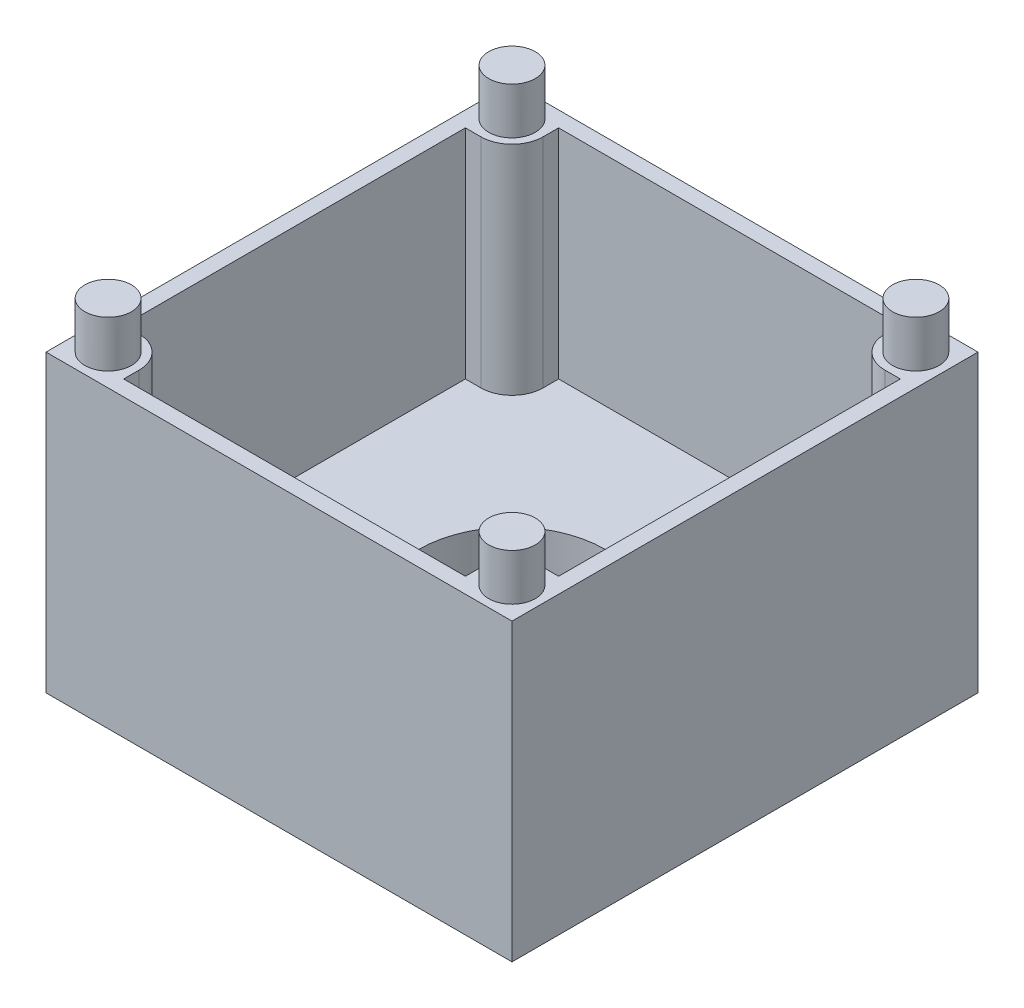
ISO-10303-21;
HEADER;
FILE_DESCRIPTION(('STEP AP214'),'2;1');
FILE_NAME('part.step','',(''),(''),'','','');
FILE_SCHEMA(('AUTOMOTIVE_DESIGN { 1 0 10303 214 1 1 1 1 }'));
ENDSEC;
DATA;
#1=APPLICATION_CONTEXT('core data for automotive mechanical design processes');
#2=APPLICATION_PROTOCOL_DEFINITION('international standard','automotive_design',2000,#1);
#3=PRODUCT_CONTEXT('',#1,'mechanical');
#4=PRODUCT('Part','Part','',(#3));
#5=PRODUCT_RELATED_PRODUCT_CATEGORY('part','',(#4));
#6=PRODUCT_DEFINITION_FORMATION('','',#4);
#7=PRODUCT_DEFINITION_CONTEXT('part definition',#1,'design');
#8=PRODUCT_DEFINITION('design','',#6,#7);
#9=PRODUCT_DEFINITION_SHAPE('','',#8);
#10=(LENGTH_UNIT() NAMED_UNIT(*) SI_UNIT(.MILLI.,.METRE.));
#11=(NAMED_UNIT(*) PLANE_ANGLE_UNIT() SI_UNIT($,.RADIAN.));
#12=(NAMED_UNIT(*) SI_UNIT($,.STERADIAN.) SOLID_ANGLE_UNIT());
#13=UNCERTAINTY_MEASURE_WITH_UNIT(LENGTH_MEASURE(1.E-05),#10,'distance_accuracy_value','');
#14=(GEOMETRIC_REPRESENTATION_CONTEXT(3) GLOBAL_UNCERTAINTY_ASSIGNED_CONTEXT((#13)) GLOBAL_UNIT_ASSIGNED_CONTEXT((#10,
#11,#12)) REPRESENTATION_CONTEXT('',''));
#15=CARTESIAN_POINT('',(0.,0.,0.));
#16=DIRECTION('',(0.,0.,1.));
#17=DIRECTION('',(1.,0.,0.));
#18=AXIS2_PLACEMENT_3D('',#15,#16,#17);
#19=CARTESIAN_POINT('',(-7.5,9.5,-7.5));
#20=DIRECTION('',(0.,-1.,0.));
#21=DIRECTION('',(0.,0.,-1.));
#22=AXIS2_PLACEMENT_3D('',#19,#20,#21);
#23=PLANE('',#22);
#24=CARTESIAN_POINT('',(6.5,9.5,6.5));
#25=DIRECTION('',(0.,-1.,0.));
#26=DIRECTION('',(0.,0.,-1.));
#27=AXIS2_PLACEMENT_3D('',#24,#25,#26);
#28=CIRCLE('',#27,0.749999999999999);
#29=CARTESIAN_POINT('',(6.5,9.5,5.75));
#30=VERTEX_POINT('',#29);
#31=EDGE_CURVE('E42',#30,#30,#28,.F.);
#32=ORIENTED_EDGE('',*,*,#31,.F.);
#33=EDGE_LOOP('',(#32));
#34=FACE_BOUND('',#33,.T.);
#35=CARTESIAN_POINT('',(-6.5,9.5,-6.5));
#36=DIRECTION('',(0.,-1.,0.));
#37=DIRECTION('',(0.,0.,-1.));
#38=AXIS2_PLACEMENT_3D('',#35,#36,#37);
#39=CIRCLE('',#38,0.749999999999999);
#40=CARTESIAN_POINT('',(-6.5,9.5,-7.25));
#41=VERTEX_POINT('',#40);
#42=EDGE_CURVE('E341',#41,#41,#39,.F.);
#43=ORIENTED_EDGE('',*,*,#42,.F.);
#44=EDGE_LOOP('',(#43));
#45=FACE_BOUND('',#44,.T.);
#46=DIRECTION('',(0.,0.,1.));
#47=VECTOR('',#46,1.);
#48=CARTESIAN_POINT('',(-5.5,9.5,6.5));
#49=LINE('',#48,#47);
#50=CARTESIAN_POINT('',(-5.5,9.5,6.5));
#51=VERTEX_POINT('',#50);
#52=CARTESIAN_POINT('',(-5.5,9.5,7.));
#53=VERTEX_POINT('',#52);
#54=EDGE_CURVE('E249',#51,#53,#49,.T.);
#55=ORIENTED_EDGE('',*,*,#54,.F.);
#56=CARTESIAN_POINT('',(-6.5,9.5,6.5));
#57=DIRECTION('',(0.,-1.,0.));
#58=DIRECTION('',(0.,0.,1.));
#59=AXIS2_PLACEMENT_3D('',#56,#57,#58);
#60=CIRCLE('',#59,1.);
#61=CARTESIAN_POINT('',(-6.5,9.5,5.5));
#62=VERTEX_POINT('',#61);
#63=EDGE_CURVE('E49',#62,#51,#60,.T.);
#64=ORIENTED_EDGE('',*,*,#63,.F.);
#65=DIRECTION('',(1.,0.,0.));
#66=VECTOR('',#65,1.);
#67=CARTESIAN_POINT('',(-6.5,9.5,5.5));
#68=LINE('',#67,#66);
#69=CARTESIAN_POINT('',(-7.,9.5,5.5));
#70=VERTEX_POINT('',#69);
#71=EDGE_CURVE('E202',#70,#62,#68,.T.);
#72=ORIENTED_EDGE('',*,*,#71,.F.);
#73=DIRECTION('',(0.,0.,1.));
#74=VECTOR('',#73,1.);
#75=CARTESIAN_POINT('',(-7.,9.5,5.5));
#76=LINE('',#75,#74);
#77=CARTESIAN_POINT('',(-7.,9.5,-5.5));
#78=VERTEX_POINT('',#77);
#79=EDGE_CURVE('E205',#78,#70,#76,.T.);
#80=ORIENTED_EDGE('',*,*,#79,.F.);
#81=DIRECTION('',(-1.,0.,0.));
#82=VECTOR('',#81,1.);
#83=CARTESIAN_POINT('',(-6.5,9.5,-5.5));
#84=LINE('',#83,#82);
#85=CARTESIAN_POINT('',(-6.5,9.5,-5.5));
#86=VERTEX_POINT('',#85);
#87=EDGE_CURVE('E284',#86,#78,#84,.T.);
#88=ORIENTED_EDGE('',*,*,#87,.F.);
#89=CARTESIAN_POINT('',(-6.5,9.5,-6.5));
#90=DIRECTION('',(0.,-1.,0.));
#91=DIRECTION('',(0.,0.,1.));
#92=AXIS2_PLACEMENT_3D('',#89,#90,#91);
#93=CIRCLE('',#92,1.);
#94=CARTESIAN_POINT('',(-5.5,9.5,-6.5));
#95=VERTEX_POINT('',#94);
#96=EDGE_CURVE('E281',#95,#86,#93,.T.);
#97=ORIENTED_EDGE('',*,*,#96,.F.);
#98=DIRECTION('',(0.,0.,1.));
#99=VECTOR('',#98,1.);
#100=CARTESIAN_POINT('',(-5.5,9.5,-6.5));
#101=LINE('',#100,#99);
#102=CARTESIAN_POINT('',(-5.5,9.5,-7.));
#103=VERTEX_POINT('',#102);
#104=EDGE_CURVE('E278',#103,#95,#101,.T.);
#105=ORIENTED_EDGE('',*,*,#104,.F.);
#106=DIRECTION('',(-1.,0.,0.));
#107=VECTOR('',#106,1.);
#108=CARTESIAN_POINT('',(-5.5,9.5,-7.));
#109=LINE('',#108,#107);
#110=CARTESIAN_POINT('',(5.5,9.5,-7.));
#111=VERTEX_POINT('',#110);
#112=EDGE_CURVE('E275',#111,#103,#109,.T.);
#113=ORIENTED_EDGE('',*,*,#112,.F.);
#114=DIRECTION('',(0.,0.,-1.));
#115=VECTOR('',#114,1.);
#116=CARTESIAN_POINT('',(5.5,9.5,-6.5));
#117=LINE('',#116,#115);
#118=CARTESIAN_POINT('',(5.5,9.5,-6.5));
#119=VERTEX_POINT('',#118);
#120=EDGE_CURVE('E272',#119,#111,#117,.T.);
#121=ORIENTED_EDGE('',*,*,#120,.F.);
#122=CARTESIAN_POINT('',(6.5,9.5,-6.5));
#123=DIRECTION('',(0.,-1.,0.));
#124=DIRECTION('',(0.,0.,1.));
#125=AXIS2_PLACEMENT_3D('',#122,#123,#124);
#126=CIRCLE('',#125,1.);
#127=CARTESIAN_POINT('',(6.5,9.5,-5.5));
#128=VERTEX_POINT('',#127);
#129=EDGE_CURVE('E269',#128,#119,#126,.T.);
#130=ORIENTED_EDGE('',*,*,#129,.F.);
#131=DIRECTION('',(-1.,0.,0.));
#132=VECTOR('',#131,1.);
#133=CARTESIAN_POINT('',(6.5,9.5,-5.5));
#134=LINE('',#133,#132);
#135=CARTESIAN_POINT('',(7.,9.5,-5.5));
#136=VERTEX_POINT('',#135);
#137=EDGE_CURVE('E266',#136,#128,#134,.T.);
#138=ORIENTED_EDGE('',*,*,#137,.F.);
#139=DIRECTION('',(0.,0.,-1.));
#140=VECTOR('',#139,1.);
#141=CARTESIAN_POINT('',(7.,9.5,5.5));
#142=LINE('',#141,#140);
#143=CARTESIAN_POINT('',(7.,9.5,5.5));
#144=VERTEX_POINT('',#143);
#145=EDGE_CURVE('E263',#144,#136,#142,.T.);
#146=ORIENTED_EDGE('',*,*,#145,.F.);
#147=DIRECTION('',(1.,0.,0.));
#148=VECTOR('',#147,1.);
#149=CARTESIAN_POINT('',(6.5,9.5,5.5));
#150=LINE('',#149,#148);
#151=CARTESIAN_POINT('',(6.5,9.5,5.5));
#152=VERTEX_POINT('',#151);
#153=EDGE_CURVE('E260',#152,#144,#150,.T.);
#154=ORIENTED_EDGE('',*,*,#153,.F.);
#155=CARTESIAN_POINT('',(6.5,9.5,6.5));
#156=DIRECTION('',(0.,-1.,0.));
#157=DIRECTION('',(0.,0.,1.));
#158=AXIS2_PLACEMENT_3D('',#155,#156,#157);
#159=CIRCLE('',#158,1.);
#160=CARTESIAN_POINT('',(5.5,9.5,6.5));
#161=VERTEX_POINT('',#160);
#162=EDGE_CURVE('E257',#161,#152,#159,.T.);
#163=ORIENTED_EDGE('',*,*,#162,.F.);
#164=DIRECTION('',(0.,0.,-1.));
#165=VECTOR('',#164,1.);
#166=CARTESIAN_POINT('',(5.5,9.5,6.5));
#167=LINE('',#166,#165);
#168=CARTESIAN_POINT('',(5.5,9.5,7.));
#169=VERTEX_POINT('',#168);
#170=EDGE_CURVE('E254',#169,#161,#167,.T.);
#171=ORIENTED_EDGE('',*,*,#170,.F.);
#172=DIRECTION('',(1.,0.,0.));
#173=VECTOR('',#172,1.);
#174=CARTESIAN_POINT('',(-5.5,9.5,7.));
#175=LINE('',#174,#173);
#176=EDGE_CURVE('E251',#53,#169,#175,.T.);
#177=ORIENTED_EDGE('',*,*,#176,.F.);
#178=EDGE_LOOP('',(#55,#64,#72,#80,#88,#97,#105,#113,#121,#130,#138,#146,#154,#163,#171,#177));
#179=FACE_BOUND('',#178,.T.);
#180=DIRECTION('',(0.,0.,1.));
#181=VECTOR('',#180,1.);
#182=CARTESIAN_POINT('',(-7.5,9.5,7.5));
#183=LINE('',#182,#181);
#184=CARTESIAN_POINT('',(-7.5,9.5,-7.5));
#185=VERTEX_POINT('',#184);
#186=CARTESIAN_POINT('',(-7.5,9.5,7.5));
#187=VERTEX_POINT('',#186);
#188=EDGE_CURVE('E319',#185,#187,#183,.T.);
#189=ORIENTED_EDGE('',*,*,#188,.T.);
#190=DIRECTION('',(1.,0.,0.));
#191=VECTOR('',#190,1.);
#192=CARTESIAN_POINT('',(-7.5,9.5,7.5));
#193=LINE('',#192,#191);
#194=CARTESIAN_POINT('',(7.5,9.5,7.5));
#195=VERTEX_POINT('',#194);
#196=EDGE_CURVE('E87',#187,#195,#193,.T.);
#197=ORIENTED_EDGE('',*,*,#196,.T.);
#198=DIRECTION('',(0.,0.,-1.));
#199=VECTOR('',#198,1.);
#200=CARTESIAN_POINT('',(7.5,9.5,7.5));
#201=LINE('',#200,#199);
#202=CARTESIAN_POINT('',(7.5,9.5,-7.5));
#203=VERTEX_POINT('',#202);
#204=EDGE_CURVE('E322',#195,#203,#201,.T.);
#205=ORIENTED_EDGE('',*,*,#204,.T.);
#206=DIRECTION('',(-1.,0.,0.));
#207=VECTOR('',#206,1.);
#208=CARTESIAN_POINT('',(-7.5,9.5,-7.5));
#209=LINE('',#208,#207);
#210=EDGE_CURVE('E58',#203,#185,#209,.T.);
#211=ORIENTED_EDGE('',*,*,#210,.T.);
#212=EDGE_LOOP('',(#189,#197,#205,#211));
#213=FACE_BOUND('',#212,.T.);
#214=CARTESIAN_POINT('',(-6.5,9.5,6.5));
#215=DIRECTION('',(0.,-1.,0.));
#216=DIRECTION('',(0.,0.,-1.));
#217=AXIS2_PLACEMENT_3D('',#214,#215,#216);
#218=CIRCLE('',#217,0.749999999999999);
#219=CARTESIAN_POINT('',(-6.5,9.5,5.75));
#220=VERTEX_POINT('',#219);
#221=EDGE_CURVE('E344',#220,#220,#218,.F.);
#222=ORIENTED_EDGE('',*,*,#221,.F.);
#223=EDGE_LOOP('',(#222));
#224=FACE_BOUND('',#223,.T.);
#225=CARTESIAN_POINT('',(6.5,9.5,-6.5));
#226=DIRECTION('',(0.,-1.,0.));
#227=DIRECTION('',(0.,0.,-1.));
#228=AXIS2_PLACEMENT_3D('',#225,#226,#227);
#229=CIRCLE('',#228,0.749999999999999);
#230=CARTESIAN_POINT('',(6.5,9.5,-7.25));
#231=VERTEX_POINT('',#230);
#232=EDGE_CURVE('E11',#231,#231,#229,.F.);
#233=ORIENTED_EDGE('',*,*,#232,.F.);
#234=EDGE_LOOP('',(#233));
#235=FACE_BOUND('',#234,.T.);
#236=ADVANCED_FACE('F34',(#34,#45,#179,#213,#224,#235),#23,.F.);
#237=CARTESIAN_POINT('',(-7.5,9.5,7.5));
#238=DIRECTION('',(1.,0.,0.));
#239=DIRECTION('',(0.,0.,-1.));
#240=AXIS2_PLACEMENT_3D('',#237,#238,#239);
#241=PLANE('',#240);
#242=DIRECTION('',(0.,0.,1.));
#243=VECTOR('',#242,1.);
#244=CARTESIAN_POINT('',(-7.5,0.,7.5));
#245=LINE('',#244,#243);
#246=CARTESIAN_POINT('',(-7.5,0.,-7.5));
#247=VERTEX_POINT('',#246);
#248=CARTESIAN_POINT('',(-7.5,0.,7.5));
#249=VERTEX_POINT('',#248);
#250=EDGE_CURVE('E291',#247,#249,#245,.T.);
#251=ORIENTED_EDGE('',*,*,#250,.T.);
#252=DIRECTION('',(0.,-1.,0.));
#253=VECTOR('',#252,1.);
#254=CARTESIAN_POINT('',(-7.5,9.5,7.5));
#255=LINE('',#254,#253);
#256=EDGE_CURVE('E339',#187,#249,#255,.T.);
#257=ORIENTED_EDGE('',*,*,#256,.F.);
#258=ORIENTED_EDGE('',*,*,#188,.F.);
#259=DIRECTION('',(0.,-1.,0.));
#260=VECTOR('',#259,1.);
#261=CARTESIAN_POINT('',(-7.5,9.5,-7.5));
#262=LINE('',#261,#260);
#263=EDGE_CURVE('E325',#185,#247,#262,.T.);
#264=ORIENTED_EDGE('',*,*,#263,.T.);
#265=EDGE_LOOP('',(#251,#257,#258,#264));
#266=FACE_BOUND('',#265,.T.);
#267=ADVANCED_FACE('F36',(#266),#241,.F.);
#268=CARTESIAN_POINT('',(-7.5,9.5,7.5));
#269=DIRECTION('',(0.,0.,-1.));
#270=DIRECTION('',(-1.,0.,0.));
#271=AXIS2_PLACEMENT_3D('',#268,#269,#270);
#272=PLANE('',#271);
#273=DIRECTION('',(1.,0.,0.));
#274=VECTOR('',#273,1.);
#275=CARTESIAN_POINT('',(-7.5,0.,7.5));
#276=LINE('',#275,#274);
#277=CARTESIAN_POINT('',(7.5,0.,7.5));
#278=VERTEX_POINT('',#277);
#279=EDGE_CURVE('E328',#249,#278,#276,.T.);
#280=ORIENTED_EDGE('',*,*,#279,.T.);
#281=DIRECTION('',(0.,-1.,0.));
#282=VECTOR('',#281,1.);
#283=CARTESIAN_POINT('',(7.5,9.5,7.5));
#284=LINE('',#283,#282);
#285=EDGE_CURVE('E336',#195,#278,#284,.T.);
#286=ORIENTED_EDGE('',*,*,#285,.F.);
#287=ORIENTED_EDGE('',*,*,#196,.F.);
#288=ORIENTED_EDGE('',*,*,#256,.T.);
#289=EDGE_LOOP('',(#280,#286,#287,#288));
#290=FACE_BOUND('',#289,.T.);
#291=ADVANCED_FACE('F473',(#290),#272,.F.);
#292=CARTESIAN_POINT('',(7.5,9.5,7.5));
#293=DIRECTION('',(-1.,0.,0.));
#294=DIRECTION('',(0.,0.,1.));
#295=AXIS2_PLACEMENT_3D('',#292,#293,#294);
#296=PLANE('',#295);
#297=DIRECTION('',(0.,0.,-1.));
#298=VECTOR('',#297,1.);
#299=CARTESIAN_POINT('',(7.5,0.,7.5));
#300=LINE('',#299,#298);
#301=CARTESIAN_POINT('',(7.5,0.,-7.5));
#302=VERTEX_POINT('',#301);
#303=EDGE_CURVE('E330',#278,#302,#300,.T.);
#304=ORIENTED_EDGE('',*,*,#303,.T.);
#305=DIRECTION('',(0.,-1.,0.));
#306=VECTOR('',#305,1.);
#307=CARTESIAN_POINT('',(7.5,9.5,-7.5));
#308=LINE('',#307,#306);
#309=EDGE_CURVE('E334',#203,#302,#308,.T.);
#310=ORIENTED_EDGE('',*,*,#309,.F.);
#311=ORIENTED_EDGE('',*,*,#204,.F.);
#312=ORIENTED_EDGE('',*,*,#285,.T.);
#313=EDGE_LOOP('',(#304,#310,#311,#312));
#314=FACE_BOUND('',#313,.T.);
#315=ADVANCED_FACE('F471',(#314),#296,.F.);
#316=CARTESIAN_POINT('',(-7.5,9.5,-7.5));
#317=DIRECTION('',(0.,0.,1.));
#318=DIRECTION('',(1.,0.,0.));
#319=AXIS2_PLACEMENT_3D('',#316,#317,#318);
#320=PLANE('',#319);
#321=DIRECTION('',(-1.,0.,0.));
#322=VECTOR('',#321,1.);
#323=CARTESIAN_POINT('',(-7.5,0.,-7.5));
#324=LINE('',#323,#322);
#325=EDGE_CURVE('E79',#302,#247,#324,.T.);
#326=ORIENTED_EDGE('',*,*,#325,.T.);
#327=ORIENTED_EDGE('',*,*,#263,.F.);
#328=ORIENTED_EDGE('',*,*,#210,.F.);
#329=ORIENTED_EDGE('',*,*,#309,.T.);
#330=EDGE_LOOP('',(#326,#327,#328,#329));
#331=FACE_BOUND('',#330,.T.);
#332=ADVANCED_FACE('F467',(#331),#320,.F.);
#333=CARTESIAN_POINT('',(-7.5,0.,-7.5));
#334=DIRECTION('',(0.,-1.,0.));
#335=DIRECTION('',(0.,0.,-1.));
#336=AXIS2_PLACEMENT_3D('',#333,#334,#335);
#337=PLANE('',#336);
#338=CARTESIAN_POINT('',(0.,0.,0.));
#339=DIRECTION('',(0.,-1.,0.));
#340=DIRECTION('',(0.,0.,-1.));
#341=AXIS2_PLACEMENT_3D('',#338,#339,#340);
#342=CIRCLE('',#341,3.);
#343=CARTESIAN_POINT('',(0.,0.,-3.));
#344=VERTEX_POINT('',#343);
#345=EDGE_CURVE('E573',#344,#344,#342,.T.);
#346=ORIENTED_EDGE('',*,*,#345,.F.);
#347=EDGE_LOOP('',(#346));
#348=FACE_BOUND('',#347,.T.);
#349=ORIENTED_EDGE('',*,*,#250,.F.);
#350=ORIENTED_EDGE('',*,*,#325,.F.);
#351=ORIENTED_EDGE('',*,*,#303,.F.);
#352=ORIENTED_EDGE('',*,*,#279,.F.);
#353=EDGE_LOOP('',(#349,#350,#351,#352));
#354=FACE_BOUND('',#353,.T.);
#355=ADVANCED_FACE('F463',(#348,#354),#337,.T.);
#356=CARTESIAN_POINT('',(-6.5,2.5,6.5));
#357=DIRECTION('',(0.,1.,0.));
#358=DIRECTION('',(0.,0.,1.));
#359=AXIS2_PLACEMENT_3D('',#356,#357,#358);
#360=CYLINDRICAL_SURFACE('',#359,1.);
#361=ORIENTED_EDGE('',*,*,#63,.T.);
#362=DIRECTION('',(0.,1.,0.));
#363=VECTOR('',#362,1.);
#364=CARTESIAN_POINT('',(-5.5,2.5,6.5));
#365=LINE('',#364,#363);
#366=CARTESIAN_POINT('',(-5.5,2.5,6.5));
#367=VERTEX_POINT('',#366);
#368=EDGE_CURVE('E179',#367,#51,#365,.T.);
#369=ORIENTED_EDGE('',*,*,#368,.F.);
#370=CARTESIAN_POINT('',(-6.5,2.5,6.5));
#371=DIRECTION('',(0.,-1.,0.));
#372=DIRECTION('',(0.,0.,1.));
#373=AXIS2_PLACEMENT_3D('',#370,#371,#372);
#374=CIRCLE('',#373,1.);
#375=CARTESIAN_POINT('',(-6.5,2.5,5.5));
#376=VERTEX_POINT('',#375);
#377=EDGE_CURVE('E183',#376,#367,#374,.T.);
#378=ORIENTED_EDGE('',*,*,#377,.F.);
#379=DIRECTION('',(0.,1.,0.));
#380=VECTOR('',#379,1.);
#381=CARTESIAN_POINT('',(-6.5,2.5,5.5));
#382=LINE('',#381,#380);
#383=EDGE_CURVE('E289',#376,#62,#382,.T.);
#384=ORIENTED_EDGE('',*,*,#383,.T.);
#385=EDGE_LOOP('',(#361,#369,#378,#384));
#386=FACE_BOUND('',#385,.T.);
#387=ADVANCED_FACE('F181',(#386),#360,.T.);
#388=CARTESIAN_POINT('',(-6.5,2.5,5.5));
#389=DIRECTION('',(0.,0.,1.));
#390=DIRECTION('',(1.,0.,0.));
#391=AXIS2_PLACEMENT_3D('',#388,#389,#390);
#392=PLANE('',#391);
#393=ORIENTED_EDGE('',*,*,#71,.T.);
#394=ORIENTED_EDGE('',*,*,#383,.F.);
#395=DIRECTION('',(1.,0.,0.));
#396=VECTOR('',#395,1.);
#397=CARTESIAN_POINT('',(-6.5,2.5,5.5));
#398=LINE('',#397,#396);
#399=CARTESIAN_POINT('',(-7.,2.5,5.5));
#400=VERTEX_POINT('',#399);
#401=EDGE_CURVE('E189',#400,#376,#398,.T.);
#402=ORIENTED_EDGE('',*,*,#401,.F.);
#403=DIRECTION('',(0.,1.,0.));
#404=VECTOR('',#403,1.);
#405=CARTESIAN_POINT('',(-7.,2.5,5.5));
#406=LINE('',#405,#404);
#407=EDGE_CURVE('E292',#400,#70,#406,.T.);
#408=ORIENTED_EDGE('',*,*,#407,.T.);
#409=EDGE_LOOP('',(#393,#394,#402,#408));
#410=FACE_BOUND('',#409,.T.);
#411=ADVANCED_FACE('F404',(#410),#392,.F.);
#412=CARTESIAN_POINT('',(-7.,2.5,5.5));
#413=DIRECTION('',(-1.,0.,0.));
#414=DIRECTION('',(0.,0.,1.));
#415=AXIS2_PLACEMENT_3D('',#412,#413,#414);
#416=PLANE('',#415);
#417=ORIENTED_EDGE('',*,*,#79,.T.);
#418=ORIENTED_EDGE('',*,*,#407,.F.);
#419=DIRECTION('',(0.,0.,1.));
#420=VECTOR('',#419,1.);
#421=CARTESIAN_POINT('',(-7.,2.5,5.5));
#422=LINE('',#421,#420);
#423=CARTESIAN_POINT('',(-7.,2.5,-5.5));
#424=VERTEX_POINT('',#423);
#425=EDGE_CURVE('E245',#424,#400,#422,.T.);
#426=ORIENTED_EDGE('',*,*,#425,.F.);
#427=DIRECTION('',(0.,1.,0.));
#428=VECTOR('',#427,1.);
#429=CARTESIAN_POINT('',(-7.,2.5,-5.5));
#430=LINE('',#429,#428);
#431=EDGE_CURVE('E294',#424,#78,#430,.T.);
#432=ORIENTED_EDGE('',*,*,#431,.T.);
#433=EDGE_LOOP('',(#417,#418,#426,#432));
#434=FACE_BOUND('',#433,.T.);
#435=ADVANCED_FACE('F407',(#434),#416,.F.);
#436=CARTESIAN_POINT('',(-6.5,2.5,-5.5));
#437=DIRECTION('',(0.,0.,-1.));
#438=DIRECTION('',(-1.,0.,0.));
#439=AXIS2_PLACEMENT_3D('',#436,#437,#438);
#440=PLANE('',#439);
#441=ORIENTED_EDGE('',*,*,#87,.T.);
#442=ORIENTED_EDGE('',*,*,#431,.F.);
#443=DIRECTION('',(-1.,0.,0.));
#444=VECTOR('',#443,1.);
#445=CARTESIAN_POINT('',(-6.5,2.5,-5.5));
#446=LINE('',#445,#444);
#447=CARTESIAN_POINT('',(-6.5,2.5,-5.5));
#448=VERTEX_POINT('',#447);
#449=EDGE_CURVE('E242',#448,#424,#446,.T.);
#450=ORIENTED_EDGE('',*,*,#449,.F.);
#451=DIRECTION('',(0.,1.,0.));
#452=VECTOR('',#451,1.);
#453=CARTESIAN_POINT('',(-6.5,2.5,-5.5));
#454=LINE('',#453,#452);
#455=EDGE_CURVE('E296',#448,#86,#454,.T.);
#456=ORIENTED_EDGE('',*,*,#455,.T.);
#457=EDGE_LOOP('',(#441,#442,#450,#456));
#458=FACE_BOUND('',#457,.T.);
#459=ADVANCED_FACE('F411',(#458),#440,.F.);
#460=CARTESIAN_POINT('',(-6.5,2.5,-6.5));
#461=DIRECTION('',(0.,1.,0.));
#462=DIRECTION('',(0.,0.,1.));
#463=AXIS2_PLACEMENT_3D('',#460,#461,#462);
#464=CYLINDRICAL_SURFACE('',#463,1.);
#465=ORIENTED_EDGE('',*,*,#96,.T.);
#466=ORIENTED_EDGE('',*,*,#455,.F.);
#467=CARTESIAN_POINT('',(-6.5,2.5,-6.5));
#468=DIRECTION('',(0.,-1.,0.));
#469=DIRECTION('',(0.,0.,1.));
#470=AXIS2_PLACEMENT_3D('',#467,#468,#469);
#471=CIRCLE('',#470,1.);
#472=CARTESIAN_POINT('',(-5.5,2.5,-6.5));
#473=VERTEX_POINT('',#472);
#474=EDGE_CURVE('E239',#473,#448,#471,.T.);
#475=ORIENTED_EDGE('',*,*,#474,.F.);
#476=DIRECTION('',(0.,1.,0.));
#477=VECTOR('',#476,1.);
#478=CARTESIAN_POINT('',(-5.5,2.5,-6.5));
#479=LINE('',#478,#477);
#480=EDGE_CURVE('E298',#473,#95,#479,.T.);
#481=ORIENTED_EDGE('',*,*,#480,.T.);
#482=EDGE_LOOP('',(#465,#466,#475,#481));
#483=FACE_BOUND('',#482,.T.);
#484=ADVANCED_FACE('F415',(#483),#464,.T.);
#485=CARTESIAN_POINT('',(-5.5,2.5,-6.5));
#486=DIRECTION('',(-1.,0.,0.));
#487=DIRECTION('',(0.,0.,1.));
#488=AXIS2_PLACEMENT_3D('',#485,#486,#487);
#489=PLANE('',#488);
#490=ORIENTED_EDGE('',*,*,#104,.T.);
#491=ORIENTED_EDGE('',*,*,#480,.F.);
#492=DIRECTION('',(0.,0.,1.));
#493=VECTOR('',#492,1.);
#494=CARTESIAN_POINT('',(-5.5,2.5,-6.5));
#495=LINE('',#494,#493);
#496=CARTESIAN_POINT('',(-5.5,2.5,-7.));
#497=VERTEX_POINT('',#496);
#498=EDGE_CURVE('E236',#497,#473,#495,.T.);
#499=ORIENTED_EDGE('',*,*,#498,.F.);
#500=DIRECTION('',(0.,1.,0.));
#501=VECTOR('',#500,1.);
#502=CARTESIAN_POINT('',(-5.5,2.5,-7.));
#503=LINE('',#502,#501);
#504=EDGE_CURVE('E300',#497,#103,#503,.T.);
#505=ORIENTED_EDGE('',*,*,#504,.T.);
#506=EDGE_LOOP('',(#490,#491,#499,#505));
#507=FACE_BOUND('',#506,.T.);
#508=ADVANCED_FACE('F419',(#507),#489,.F.);
#509=CARTESIAN_POINT('',(-5.5,2.5,-7.));
#510=DIRECTION('',(0.,0.,-1.));
#511=DIRECTION('',(-1.,0.,0.));
#512=AXIS2_PLACEMENT_3D('',#509,#510,#511);
#513=PLANE('',#512);
#514=ORIENTED_EDGE('',*,*,#112,.T.);
#515=ORIENTED_EDGE('',*,*,#504,.F.);
#516=DIRECTION('',(-1.,0.,0.));
#517=VECTOR('',#516,1.);
#518=CARTESIAN_POINT('',(-5.5,2.5,-7.));
#519=LINE('',#518,#517);
#520=CARTESIAN_POINT('',(5.5,2.5,-7.));
#521=VERTEX_POINT('',#520);
#522=EDGE_CURVE('E233',#521,#497,#519,.T.);
#523=ORIENTED_EDGE('',*,*,#522,.F.);
#524=DIRECTION('',(0.,1.,0.));
#525=VECTOR('',#524,1.);
#526=CARTESIAN_POINT('',(5.5,2.5,-7.));
#527=LINE('',#526,#525);
#528=EDGE_CURVE('E302',#521,#111,#527,.T.);
#529=ORIENTED_EDGE('',*,*,#528,.T.);
#530=EDGE_LOOP('',(#514,#515,#523,#529));
#531=FACE_BOUND('',#530,.T.);
#532=ADVANCED_FACE('F423',(#531),#513,.F.);
#533=CARTESIAN_POINT('',(5.5,2.5,-6.5));
#534=DIRECTION('',(1.,0.,0.));
#535=DIRECTION('',(0.,0.,-1.));
#536=AXIS2_PLACEMENT_3D('',#533,#534,#535);
#537=PLANE('',#536);
#538=ORIENTED_EDGE('',*,*,#120,.T.);
#539=ORIENTED_EDGE('',*,*,#528,.F.);
#540=DIRECTION('',(0.,0.,-1.));
#541=VECTOR('',#540,1.);
#542=CARTESIAN_POINT('',(5.5,2.5,-6.5));
#543=LINE('',#542,#541);
#544=CARTESIAN_POINT('',(5.5,2.5,-6.5));
#545=VERTEX_POINT('',#544);
#546=EDGE_CURVE('E230',#545,#521,#543,.T.);
#547=ORIENTED_EDGE('',*,*,#546,.F.);
#548=DIRECTION('',(0.,1.,0.));
#549=VECTOR('',#548,1.);
#550=CARTESIAN_POINT('',(5.5,2.5,-6.5));
#551=LINE('',#550,#549);
#552=EDGE_CURVE('E304',#545,#119,#551,.T.);
#553=ORIENTED_EDGE('',*,*,#552,.T.);
#554=EDGE_LOOP('',(#538,#539,#547,#553));
#555=FACE_BOUND('',#554,.T.);
#556=ADVANCED_FACE('F427',(#555),#537,.F.);
#557=CARTESIAN_POINT('',(6.5,2.5,-6.5));
#558=DIRECTION('',(0.,1.,0.));
#559=DIRECTION('',(0.,0.,1.));
#560=AXIS2_PLACEMENT_3D('',#557,#558,#559);
#561=CYLINDRICAL_SURFACE('',#560,1.);
#562=ORIENTED_EDGE('',*,*,#129,.T.);
#563=ORIENTED_EDGE('',*,*,#552,.F.);
#564=CARTESIAN_POINT('',(6.5,2.5,-6.5));
#565=DIRECTION('',(0.,-1.,0.));
#566=DIRECTION('',(0.,0.,1.));
#567=AXIS2_PLACEMENT_3D('',#564,#565,#566);
#568=CIRCLE('',#567,1.);
#569=CARTESIAN_POINT('',(6.5,2.5,-5.5));
#570=VERTEX_POINT('',#569);
#571=EDGE_CURVE('E227',#570,#545,#568,.T.);
#572=ORIENTED_EDGE('',*,*,#571,.F.);
#573=DIRECTION('',(0.,1.,0.));
#574=VECTOR('',#573,1.);
#575=CARTESIAN_POINT('',(6.5,2.5,-5.5));
#576=LINE('',#575,#574);
#577=EDGE_CURVE('E306',#570,#128,#576,.T.);
#578=ORIENTED_EDGE('',*,*,#577,.T.);
#579=EDGE_LOOP('',(#562,#563,#572,#578));
#580=FACE_BOUND('',#579,.T.);
#581=ADVANCED_FACE('F431',(#580),#561,.T.);
#582=CARTESIAN_POINT('',(6.5,2.5,-5.5));
#583=DIRECTION('',(0.,0.,-1.));
#584=DIRECTION('',(-1.,0.,0.));
#585=AXIS2_PLACEMENT_3D('',#582,#583,#584);
#586=PLANE('',#585);
#587=ORIENTED_EDGE('',*,*,#137,.T.);
#588=ORIENTED_EDGE('',*,*,#577,.F.);
#589=DIRECTION('',(-1.,0.,0.));
#590=VECTOR('',#589,1.);
#591=CARTESIAN_POINT('',(6.5,2.5,-5.5));
#592=LINE('',#591,#590);
#593=CARTESIAN_POINT('',(7.,2.5,-5.5));
#594=VERTEX_POINT('',#593);
#595=EDGE_CURVE('E224',#594,#570,#592,.T.);
#596=ORIENTED_EDGE('',*,*,#595,.F.);
#597=DIRECTION('',(0.,1.,0.));
#598=VECTOR('',#597,1.);
#599=CARTESIAN_POINT('',(7.,2.5,-5.5));
#600=LINE('',#599,#598);
#601=EDGE_CURVE('E308',#594,#136,#600,.T.);
#602=ORIENTED_EDGE('',*,*,#601,.T.);
#603=EDGE_LOOP('',(#587,#588,#596,#602));
#604=FACE_BOUND('',#603,.T.);
#605=ADVANCED_FACE('F435',(#604),#586,.F.);
#606=CARTESIAN_POINT('',(7.,2.5,5.5));
#607=DIRECTION('',(1.,0.,0.));
#608=DIRECTION('',(0.,0.,-1.));
#609=AXIS2_PLACEMENT_3D('',#606,#607,#608);
#610=PLANE('',#609);
#611=ORIENTED_EDGE('',*,*,#145,.T.);
#612=ORIENTED_EDGE('',*,*,#601,.F.);
#613=DIRECTION('',(0.,0.,-1.));
#614=VECTOR('',#613,1.);
#615=CARTESIAN_POINT('',(7.,2.5,5.5));
#616=LINE('',#615,#614);
#617=CARTESIAN_POINT('',(7.,2.5,5.5));
#618=VERTEX_POINT('',#617);
#619=EDGE_CURVE('E221',#618,#594,#616,.T.);
#620=ORIENTED_EDGE('',*,*,#619,.F.);
#621=DIRECTION('',(0.,1.,0.));
#622=VECTOR('',#621,1.);
#623=CARTESIAN_POINT('',(7.,2.5,5.5));
#624=LINE('',#623,#622);
#625=EDGE_CURVE('E310',#618,#144,#624,.T.);
#626=ORIENTED_EDGE('',*,*,#625,.T.);
#627=EDGE_LOOP('',(#611,#612,#620,#626));
#628=FACE_BOUND('',#627,.T.);
#629=ADVANCED_FACE('F439',(#628),#610,.F.);
#630=CARTESIAN_POINT('',(6.5,2.5,5.5));
#631=DIRECTION('',(0.,0.,1.));
#632=DIRECTION('',(1.,0.,0.));
#633=AXIS2_PLACEMENT_3D('',#630,#631,#632);
#634=PLANE('',#633);
#635=ORIENTED_EDGE('',*,*,#153,.T.);
#636=ORIENTED_EDGE('',*,*,#625,.F.);
#637=DIRECTION('',(1.,0.,0.));
#638=VECTOR('',#637,1.);
#639=CARTESIAN_POINT('',(6.5,2.5,5.5));
#640=LINE('',#639,#638);
#641=CARTESIAN_POINT('',(6.5,2.5,5.5));
#642=VERTEX_POINT('',#641);
#643=EDGE_CURVE('E218',#642,#618,#640,.T.);
#644=ORIENTED_EDGE('',*,*,#643,.F.);
#645=DIRECTION('',(0.,1.,0.));
#646=VECTOR('',#645,1.);
#647=CARTESIAN_POINT('',(6.5,2.5,5.5));
#648=LINE('',#647,#646);
#649=EDGE_CURVE('E312',#642,#152,#648,.T.);
#650=ORIENTED_EDGE('',*,*,#649,.T.);
#651=EDGE_LOOP('',(#635,#636,#644,#650));
#652=FACE_BOUND('',#651,.T.);
#653=ADVANCED_FACE('F443',(#652),#634,.F.);
#654=CARTESIAN_POINT('',(6.5,2.5,6.5));
#655=DIRECTION('',(0.,1.,0.));
#656=DIRECTION('',(0.,0.,1.));
#657=AXIS2_PLACEMENT_3D('',#654,#655,#656);
#658=CYLINDRICAL_SURFACE('',#657,1.);
#659=ORIENTED_EDGE('',*,*,#162,.T.);
#660=ORIENTED_EDGE('',*,*,#649,.F.);
#661=CARTESIAN_POINT('',(6.5,2.5,6.5));
#662=DIRECTION('',(0.,-1.,0.));
#663=DIRECTION('',(0.,0.,1.));
#664=AXIS2_PLACEMENT_3D('',#661,#662,#663);
#665=CIRCLE('',#664,1.);
#666=CARTESIAN_POINT('',(5.5,2.5,6.5));
#667=VERTEX_POINT('',#666);
#668=EDGE_CURVE('E215',#667,#642,#665,.T.);
#669=ORIENTED_EDGE('',*,*,#668,.F.);
#670=DIRECTION('',(0.,1.,0.));
#671=VECTOR('',#670,1.);
#672=CARTESIAN_POINT('',(5.5,2.5,6.5));
#673=LINE('',#672,#671);
#674=EDGE_CURVE('E314',#667,#161,#673,.T.);
#675=ORIENTED_EDGE('',*,*,#674,.T.);
#676=EDGE_LOOP('',(#659,#660,#669,#675));
#677=FACE_BOUND('',#676,.T.);
#678=ADVANCED_FACE('F447',(#677),#658,.T.);
#679=CARTESIAN_POINT('',(5.5,2.5,6.5));
#680=DIRECTION('',(1.,0.,0.));
#681=DIRECTION('',(0.,0.,-1.));
#682=AXIS2_PLACEMENT_3D('',#679,#680,#681);
#683=PLANE('',#682);
#684=ORIENTED_EDGE('',*,*,#170,.T.);
#685=ORIENTED_EDGE('',*,*,#674,.F.);
#686=DIRECTION('',(0.,0.,-1.));
#687=VECTOR('',#686,1.);
#688=CARTESIAN_POINT('',(5.5,2.5,6.5));
#689=LINE('',#688,#687);
#690=CARTESIAN_POINT('',(5.5,2.5,7.));
#691=VERTEX_POINT('',#690);
#692=EDGE_CURVE('E212',#691,#667,#689,.T.);
#693=ORIENTED_EDGE('',*,*,#692,.F.);
#694=DIRECTION('',(0.,1.,0.));
#695=VECTOR('',#694,1.);
#696=CARTESIAN_POINT('',(5.5,2.5,7.));
#697=LINE('',#696,#695);
#698=EDGE_CURVE('E316',#691,#169,#697,.T.);
#699=ORIENTED_EDGE('',*,*,#698,.T.);
#700=EDGE_LOOP('',(#684,#685,#693,#699));
#701=FACE_BOUND('',#700,.T.);
#702=ADVANCED_FACE('F451',(#701),#683,.F.);
#703=CARTESIAN_POINT('',(-5.5,2.5,7.));
#704=DIRECTION('',(0.,0.,1.));
#705=DIRECTION('',(1.,0.,0.));
#706=AXIS2_PLACEMENT_3D('',#703,#704,#705);
#707=PLANE('',#706);
#708=ORIENTED_EDGE('',*,*,#176,.T.);
#709=ORIENTED_EDGE('',*,*,#698,.F.);
#710=DIRECTION('',(1.,0.,0.));
#711=VECTOR('',#710,1.);
#712=CARTESIAN_POINT('',(-5.5,2.5,7.));
#713=LINE('',#712,#711);
#714=CARTESIAN_POINT('',(-5.5,2.5,7.));
#715=VERTEX_POINT('',#714);
#716=EDGE_CURVE('E197',#715,#691,#713,.T.);
#717=ORIENTED_EDGE('',*,*,#716,.F.);
#718=DIRECTION('',(0.,1.,0.));
#719=VECTOR('',#718,1.);
#720=CARTESIAN_POINT('',(-5.5,2.5,7.));
#721=LINE('',#720,#719);
#722=EDGE_CURVE('E188',#715,#53,#721,.T.);
#723=ORIENTED_EDGE('',*,*,#722,.T.);
#724=EDGE_LOOP('',(#708,#709,#717,#723));
#725=FACE_BOUND('',#724,.T.);
#726=ADVANCED_FACE('F455',(#725),#707,.F.);
#727=CARTESIAN_POINT('',(-5.5,2.5,6.5));
#728=DIRECTION('',(-1.,0.,0.));
#729=DIRECTION('',(0.,0.,1.));
#730=AXIS2_PLACEMENT_3D('',#727,#728,#729);
#731=PLANE('',#730);
#732=ORIENTED_EDGE('',*,*,#54,.T.);
#733=ORIENTED_EDGE('',*,*,#722,.F.);
#734=DIRECTION('',(0.,0.,1.));
#735=VECTOR('',#734,1.);
#736=CARTESIAN_POINT('',(-5.5,2.5,6.5));
#737=LINE('',#736,#735);
#738=EDGE_CURVE('E192',#367,#715,#737,.T.);
#739=ORIENTED_EDGE('',*,*,#738,.F.);
#740=ORIENTED_EDGE('',*,*,#368,.T.);
#741=EDGE_LOOP('',(#732,#733,#739,#740));
#742=FACE_BOUND('',#741,.T.);
#743=ADVANCED_FACE('F193',(#742),#731,.F.);
#744=CARTESIAN_POINT('',(-6.5,2.5,6.5));
#745=DIRECTION('',(0.,1.,0.));
#746=DIRECTION('',(0.,0.,1.));
#747=AXIS2_PLACEMENT_3D('',#744,#745,#746);
#748=PLANE('',#747);
#749=CARTESIAN_POINT('',(0.,2.5,0.));
#750=DIRECTION('',(0.,1.,0.));
#751=DIRECTION('',(0.,0.,1.));
#752=AXIS2_PLACEMENT_3D('',#749,#750,#751);
#753=CIRCLE('',#752,3.);
#754=CARTESIAN_POINT('',(0.,2.5,3.));
#755=VERTEX_POINT('',#754);
#756=EDGE_CURVE('E570',#755,#755,#753,.F.);
#757=ORIENTED_EDGE('',*,*,#756,.T.);
#758=EDGE_LOOP('',(#757));
#759=FACE_BOUND('',#758,.T.);
#760=ORIENTED_EDGE('',*,*,#377,.T.);
#761=ORIENTED_EDGE('',*,*,#738,.T.);
#762=ORIENTED_EDGE('',*,*,#716,.T.);
#763=ORIENTED_EDGE('',*,*,#692,.T.);
#764=ORIENTED_EDGE('',*,*,#668,.T.);
#765=ORIENTED_EDGE('',*,*,#643,.T.);
#766=ORIENTED_EDGE('',*,*,#619,.T.);
#767=ORIENTED_EDGE('',*,*,#595,.T.);
#768=ORIENTED_EDGE('',*,*,#571,.T.);
#769=ORIENTED_EDGE('',*,*,#546,.T.);
#770=ORIENTED_EDGE('',*,*,#522,.T.);
#771=ORIENTED_EDGE('',*,*,#498,.T.);
#772=ORIENTED_EDGE('',*,*,#474,.T.);
#773=ORIENTED_EDGE('',*,*,#449,.T.);
#774=ORIENTED_EDGE('',*,*,#425,.T.);
#775=ORIENTED_EDGE('',*,*,#401,.T.);
#776=EDGE_LOOP('',(#760,#761,#762,#763,#764,#765,#766,#767,#768,#769,#770,#771,#772,#773,#774,#775));
#777=FACE_BOUND('',#776,.T.);
#778=ADVANCED_FACE('F199',(#759,#777),#748,.T.);
#779=CARTESIAN_POINT('',(-6.5,11.,-6.5));
#780=DIRECTION('',(0.,-1.,0.));
#781=DIRECTION('',(0.,0.,-1.));
#782=AXIS2_PLACEMENT_3D('',#779,#780,#781);
#783=CYLINDRICAL_SURFACE('',#782,0.749999999999999);
#784=CARTESIAN_POINT('',(-6.5,11.,-6.5));
#785=DIRECTION('',(0.,1.,0.));
#786=DIRECTION('',(0.,0.,1.));
#787=AXIS2_PLACEMENT_3D('',#784,#785,#786);
#788=CIRCLE('',#787,0.749999999999999);
#789=CARTESIAN_POINT('',(-6.5,11.,-5.75));
#790=VERTEX_POINT('',#789);
#791=EDGE_CURVE('E208',#790,#790,#788,.T.);
#792=ORIENTED_EDGE('',*,*,#791,.F.);
#793=EDGE_LOOP('',(#792));
#794=FACE_BOUND('',#793,.T.);
#795=ORIENTED_EDGE('',*,*,#42,.T.);
#796=EDGE_LOOP('',(#795));
#797=FACE_BOUND('',#796,.T.);
#798=ADVANCED_FACE('F396',(#794,#797),#783,.T.);
#799=CARTESIAN_POINT('',(-6.5,11.,-6.5));
#800=DIRECTION('',(0.,1.,0.));
#801=DIRECTION('',(0.,0.,1.));
#802=AXIS2_PLACEMENT_3D('',#799,#800,#801);
#803=PLANE('',#802);
#804=ORIENTED_EDGE('',*,*,#791,.T.);
#805=EDGE_LOOP('',(#804));
#806=FACE_BOUND('',#805,.T.);
#807=ADVANCED_FACE('F392',(#806),#803,.T.);
#808=CARTESIAN_POINT('',(-6.5,11.,6.5));
#809=DIRECTION('',(0.,-1.,0.));
#810=DIRECTION('',(0.,0.,-1.));
#811=AXIS2_PLACEMENT_3D('',#808,#809,#810);
#812=CYLINDRICAL_SURFACE('',#811,0.749999999999999);
#813=CARTESIAN_POINT('',(-6.5,11.,6.5));
#814=DIRECTION('',(0.,1.,0.));
#815=DIRECTION('',(0.,0.,1.));
#816=AXIS2_PLACEMENT_3D('',#813,#814,#815);
#817=CIRCLE('',#816,0.749999999999999);
#818=CARTESIAN_POINT('',(-6.5,11.,7.25));
#819=VERTEX_POINT('',#818);
#820=EDGE_CURVE('E582',#819,#819,#817,.T.);
#821=ORIENTED_EDGE('',*,*,#820,.F.);
#822=EDGE_LOOP('',(#821));
#823=FACE_BOUND('',#822,.T.);
#824=ORIENTED_EDGE('',*,*,#221,.T.);
#825=EDGE_LOOP('',(#824));
#826=FACE_BOUND('',#825,.T.);
#827=ADVANCED_FACE('F388',(#823,#826),#812,.T.);
#828=CARTESIAN_POINT('',(-6.5,11.,6.5));
#829=DIRECTION('',(0.,1.,0.));
#830=DIRECTION('',(0.,0.,1.));
#831=AXIS2_PLACEMENT_3D('',#828,#829,#830);
#832=PLANE('',#831);
#833=ORIENTED_EDGE('',*,*,#820,.T.);
#834=EDGE_LOOP('',(#833));
#835=FACE_BOUND('',#834,.T.);
#836=ADVANCED_FACE('F384',(#835),#832,.T.);
#837=CARTESIAN_POINT('',(6.5,11.,6.5));
#838=DIRECTION('',(0.,-1.,0.));
#839=DIRECTION('',(0.,0.,-1.));
#840=AXIS2_PLACEMENT_3D('',#837,#838,#839);
#841=CYLINDRICAL_SURFACE('',#840,0.749999999999999);
#842=CARTESIAN_POINT('',(6.5,11.,6.5));
#843=DIRECTION('',(0.,1.,0.));
#844=DIRECTION('',(0.,0.,1.));
#845=AXIS2_PLACEMENT_3D('',#842,#843,#844);
#846=CIRCLE('',#845,0.749999999999999);
#847=CARTESIAN_POINT('',(6.5,11.,7.25));
#848=VERTEX_POINT('',#847);
#849=EDGE_CURVE('E577',#848,#848,#846,.T.);
#850=ORIENTED_EDGE('',*,*,#849,.F.);
#851=EDGE_LOOP('',(#850));
#852=FACE_BOUND('',#851,.T.);
#853=ORIENTED_EDGE('',*,*,#31,.T.);
#854=EDGE_LOOP('',(#853));
#855=FACE_BOUND('',#854,.T.);
#856=ADVANCED_FACE('F349',(#852,#855),#841,.T.);
#857=CARTESIAN_POINT('',(6.5,11.,6.5));
#858=DIRECTION('',(0.,1.,0.));
#859=DIRECTION('',(0.,0.,1.));
#860=AXIS2_PLACEMENT_3D('',#857,#858,#859);
#861=PLANE('',#860);
#862=ORIENTED_EDGE('',*,*,#849,.T.);
#863=EDGE_LOOP('',(#862));
#864=FACE_BOUND('',#863,.T.);
#865=ADVANCED_FACE('F367',(#864),#861,.T.);
#866=CARTESIAN_POINT('',(6.5,11.,-6.5));
#867=DIRECTION('',(0.,-1.,0.));
#868=DIRECTION('',(0.,0.,-1.));
#869=AXIS2_PLACEMENT_3D('',#866,#867,#868);
#870=CYLINDRICAL_SURFACE('',#869,0.749999999999999);
#871=CARTESIAN_POINT('',(6.5,11.,-6.5));
#872=DIRECTION('',(0.,1.,0.));
#873=DIRECTION('',(0.,0.,1.));
#874=AXIS2_PLACEMENT_3D('',#871,#872,#873);
#875=CIRCLE('',#874,0.749999999999999);
#876=CARTESIAN_POINT('',(6.5,11.,-5.75));
#877=VERTEX_POINT('',#876);
#878=EDGE_CURVE('E574',#877,#877,#875,.T.);
#879=ORIENTED_EDGE('',*,*,#878,.F.);
#880=EDGE_LOOP('',(#879));
#881=FACE_BOUND('',#880,.T.);
#882=ORIENTED_EDGE('',*,*,#232,.T.);
#883=EDGE_LOOP('',(#882));
#884=FACE_BOUND('',#883,.T.);
#885=ADVANCED_FACE('F364',(#881,#884),#870,.T.);
#886=CARTESIAN_POINT('',(6.5,11.,-6.5));
#887=DIRECTION('',(0.,1.,0.));
#888=DIRECTION('',(0.,0.,1.));
#889=AXIS2_PLACEMENT_3D('',#886,#887,#888);
#890=PLANE('',#889);
#891=ORIENTED_EDGE('',*,*,#878,.T.);
#892=EDGE_LOOP('',(#891));
#893=FACE_BOUND('',#892,.T.);
#894=ADVANCED_FACE('F366',(#893),#890,.T.);
#895=CARTESIAN_POINT('',(0.,11.001,0.));
#896=DIRECTION('',(0.,-1.,0.));
#897=DIRECTION('',(0.,0.,-1.));
#898=AXIS2_PLACEMENT_3D('',#895,#896,#897);
#899=CYLINDRICAL_SURFACE('',#898,3.);
#900=ORIENTED_EDGE('',*,*,#756,.F.);
#901=EDGE_LOOP('',(#900));
#902=FACE_BOUND('',#901,.T.);
#903=ORIENTED_EDGE('',*,*,#345,.T.);
#904=EDGE_LOOP('',(#903));
#905=FACE_BOUND('',#904,.T.);
#906=ADVANCED_FACE('F374',(#902,#905),#899,.F.);
#907=CLOSED_SHELL('',(#236,#267,#291,#315,#332,#355,#387,#411,#435,#459,#484,#508,#532,#556,
#581,#605,#629,#653,#678,#702,#726,#743,#778,#798,#807,#827,#836,#856,#865,#885,#894,#906));
#908=MANIFOLD_SOLID_BREP('B2',#907);
#909=ADVANCED_BREP_SHAPE_REPRESENTATION('',(#18,#908),#14);
#910=SHAPE_DEFINITION_REPRESENTATION(#9,#909);
ENDSEC;
END-ISO-10303-21;
